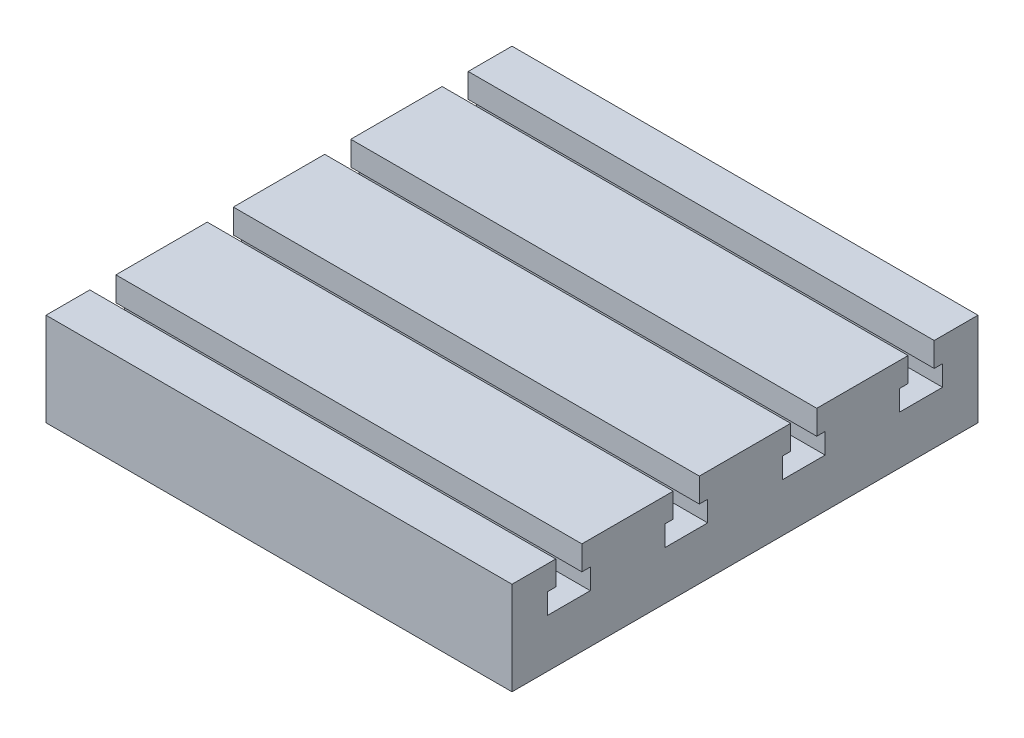
ISO-10303-21;
HEADER;
FILE_DESCRIPTION(('STEP AP214'),'2;1');
FILE_NAME('part.step','',(''),(''),'','','');
FILE_SCHEMA(('AUTOMOTIVE_DESIGN { 1 0 10303 214 1 1 1 1 }'));
ENDSEC;
DATA;
#1=APPLICATION_CONTEXT('core data for automotive mechanical design processes');
#2=APPLICATION_PROTOCOL_DEFINITION('international standard','automotive_design',2000,#1);
#3=PRODUCT_CONTEXT('',#1,'mechanical');
#4=PRODUCT('Part','Part','',(#3));
#5=PRODUCT_RELATED_PRODUCT_CATEGORY('part','',(#4));
#6=PRODUCT_DEFINITION_FORMATION('','',#4);
#7=PRODUCT_DEFINITION_CONTEXT('part definition',#1,'design');
#8=PRODUCT_DEFINITION('design','',#6,#7);
#9=PRODUCT_DEFINITION_SHAPE('','',#8);
#10=(LENGTH_UNIT() NAMED_UNIT(*) SI_UNIT(.MILLI.,.METRE.));
#11=(NAMED_UNIT(*) PLANE_ANGLE_UNIT() SI_UNIT($,.RADIAN.));
#12=(NAMED_UNIT(*) SI_UNIT($,.STERADIAN.) SOLID_ANGLE_UNIT());
#13=UNCERTAINTY_MEASURE_WITH_UNIT(LENGTH_MEASURE(1.E-05),#10,'distance_accuracy_value','');
#14=(GEOMETRIC_REPRESENTATION_CONTEXT(3) GLOBAL_UNCERTAINTY_ASSIGNED_CONTEXT((#13)) GLOBAL_UNIT_ASSIGNED_CONTEXT((#10,
#11,#12)) REPRESENTATION_CONTEXT('',''));
#15=CARTESIAN_POINT('',(0.,0.,0.));
#16=DIRECTION('',(0.,0.,1.));
#17=DIRECTION('',(1.,0.,0.));
#18=AXIS2_PLACEMENT_3D('',#15,#16,#17);
#19=CARTESIAN_POINT('',(-125.,0.,-125.));
#20=DIRECTION('',(0.,1.,0.));
#21=DIRECTION('',(0.,0.,1.));
#22=AXIS2_PLACEMENT_3D('',#19,#20,#21);
#23=PLANE('',#22);
#24=DIRECTION('',(1.,0.,0.));
#25=VECTOR('',#24,1.);
#26=CARTESIAN_POINT('',(-125.,0.,-101.5));
#27=LINE('',#26,#25);
#28=CARTESIAN_POINT('',(-125.,0.,-101.5));
#29=VERTEX_POINT('',#28);
#30=CARTESIAN_POINT('',(125.,0.,-101.5));
#31=VERTEX_POINT('',#30);
#32=EDGE_CURVE('E268',#29,#31,#27,.T.);
#33=ORIENTED_EDGE('',*,*,#32,.T.);
#34=DIRECTION('',(0.,0.,1.));
#35=VECTOR('',#34,1.);
#36=CARTESIAN_POINT('',(125.,0.,-125.));
#37=LINE('',#36,#35);
#38=CARTESIAN_POINT('',(125.,0.,-125.));
#39=VERTEX_POINT('',#38);
#40=EDGE_CURVE('E316',#39,#31,#37,.T.);
#41=ORIENTED_EDGE('',*,*,#40,.F.);
#42=DIRECTION('',(1.,0.,0.));
#43=VECTOR('',#42,1.);
#44=CARTESIAN_POINT('',(-125.,0.,-125.));
#45=LINE('',#44,#43);
#46=CARTESIAN_POINT('',(-125.,0.,-125.));
#47=VERTEX_POINT('',#46);
#48=EDGE_CURVE('E36',#47,#39,#45,.T.);
#49=ORIENTED_EDGE('',*,*,#48,.F.);
#50=DIRECTION('',(0.,0.,1.));
#51=VECTOR('',#50,1.);
#52=CARTESIAN_POINT('',(-125.,0.,-125.));
#53=LINE('',#52,#51);
#54=EDGE_CURVE('E285',#47,#29,#53,.T.);
#55=ORIENTED_EDGE('',*,*,#54,.T.);
#56=EDGE_LOOP('',(#33,#41,#49,#55));
#57=FACE_BOUND('',#56,.T.);
#58=ADVANCED_FACE('F32',(#57),#23,.T.);
#59=DIRECTION('',(1.,0.,0.));
#60=VECTOR('',#59,1.);
#61=CARTESIAN_POINT('',(-125.,0.,-87.5));
#62=LINE('',#61,#60);
#63=CARTESIAN_POINT('',(-125.,0.,-87.5));
#64=VERTEX_POINT('',#63);
#65=CARTESIAN_POINT('',(125.,0.,-87.5));
#66=VERTEX_POINT('',#65);
#67=EDGE_CURVE('E49',#64,#66,#62,.T.);
#68=ORIENTED_EDGE('',*,*,#67,.F.);
#69=CARTESIAN_POINT('',(-125.,0.,-38.5));
#70=VERTEX_POINT('',#69);
#71=EDGE_CURVE('E293',#64,#70,#53,.T.);
#72=ORIENTED_EDGE('',*,*,#71,.T.);
#73=DIRECTION('',(1.,0.,0.));
#74=VECTOR('',#73,1.);
#75=CARTESIAN_POINT('',(-125.,0.,-38.5));
#76=LINE('',#75,#74);
#77=CARTESIAN_POINT('',(125.,0.,-38.5));
#78=VERTEX_POINT('',#77);
#79=EDGE_CURVE('E442',#70,#78,#76,.T.);
#80=ORIENTED_EDGE('',*,*,#79,.T.);
#81=EDGE_CURVE('E318',#66,#78,#37,.T.);
#82=ORIENTED_EDGE('',*,*,#81,.F.);
#83=EDGE_LOOP('',(#68,#72,#80,#82));
#84=FACE_BOUND('',#83,.T.);
#85=ADVANCED_FACE('F546',(#84),#23,.T.);
#86=DIRECTION('',(1.,0.,0.));
#87=VECTOR('',#86,1.);
#88=CARTESIAN_POINT('',(-125.,0.,-24.5));
#89=LINE('',#88,#87);
#90=CARTESIAN_POINT('',(-125.,0.,-24.5));
#91=VERTEX_POINT('',#90);
#92=CARTESIAN_POINT('',(125.,0.,-24.5));
#93=VERTEX_POINT('',#92);
#94=EDGE_CURVE('E57',#91,#93,#89,.T.);
#95=ORIENTED_EDGE('',*,*,#94,.F.);
#96=CARTESIAN_POINT('',(-125.,0.,24.5));
#97=VERTEX_POINT('',#96);
#98=EDGE_CURVE('E299',#91,#97,#53,.T.);
#99=ORIENTED_EDGE('',*,*,#98,.T.);
#100=DIRECTION('',(1.,0.,0.));
#101=VECTOR('',#100,1.);
#102=CARTESIAN_POINT('',(-125.,0.,24.5));
#103=LINE('',#102,#101);
#104=CARTESIAN_POINT('',(125.,0.,24.5));
#105=VERTEX_POINT('',#104);
#106=EDGE_CURVE('E383',#97,#105,#103,.T.);
#107=ORIENTED_EDGE('',*,*,#106,.T.);
#108=EDGE_CURVE('E550',#93,#105,#37,.T.);
#109=ORIENTED_EDGE('',*,*,#108,.F.);
#110=EDGE_LOOP('',(#95,#99,#107,#109));
#111=FACE_BOUND('',#110,.T.);
#112=ADVANCED_FACE('F632',(#111),#23,.T.);
#113=DIRECTION('',(1.,0.,0.));
#114=VECTOR('',#113,1.);
#115=CARTESIAN_POINT('',(-125.,0.,38.5));
#116=LINE('',#115,#114);
#117=CARTESIAN_POINT('',(-125.,0.,38.5));
#118=VERTEX_POINT('',#117);
#119=CARTESIAN_POINT('',(125.,0.,38.5));
#120=VERTEX_POINT('',#119);
#121=EDGE_CURVE('E386',#118,#120,#116,.T.);
#122=ORIENTED_EDGE('',*,*,#121,.F.);
#123=CARTESIAN_POINT('',(-125.,0.,87.5));
#124=VERTEX_POINT('',#123);
#125=EDGE_CURVE('E301',#118,#124,#53,.T.);
#126=ORIENTED_EDGE('',*,*,#125,.T.);
#127=DIRECTION('',(1.,0.,0.));
#128=VECTOR('',#127,1.);
#129=CARTESIAN_POINT('',(-125.,0.,87.5));
#130=LINE('',#129,#128);
#131=CARTESIAN_POINT('',(125.,0.,87.5));
#132=VERTEX_POINT('',#131);
#133=EDGE_CURVE('E323',#124,#132,#130,.T.);
#134=ORIENTED_EDGE('',*,*,#133,.T.);
#135=EDGE_CURVE('E551',#120,#132,#37,.T.);
#136=ORIENTED_EDGE('',*,*,#135,.F.);
#137=EDGE_LOOP('',(#122,#126,#134,#136));
#138=FACE_BOUND('',#137,.T.);
#139=ADVANCED_FACE('F603',(#138),#23,.T.);
#140=CARTESIAN_POINT('',(-125.,0.,-125.));
#141=DIRECTION('',(0.,0.,-1.));
#142=DIRECTION('',(-1.,0.,0.));
#143=AXIS2_PLACEMENT_3D('',#140,#141,#142);
#144=PLANE('',#143);
#145=ORIENTED_EDGE('',*,*,#48,.T.);
#146=DIRECTION('',(0.,1.,0.));
#147=VECTOR('',#146,1.);
#148=CARTESIAN_POINT('',(125.,0.,-125.));
#149=LINE('',#148,#147);
#150=CARTESIAN_POINT('',(125.,-50.,-125.));
#151=VERTEX_POINT('',#150);
#152=EDGE_CURVE('E320',#151,#39,#149,.T.);
#153=ORIENTED_EDGE('',*,*,#152,.F.);
#154=DIRECTION('',(1.,0.,0.));
#155=VECTOR('',#154,1.);
#156=CARTESIAN_POINT('',(-125.,-50.,-125.));
#157=LINE('',#156,#155);
#158=CARTESIAN_POINT('',(-125.,-50.,-125.));
#159=VERTEX_POINT('',#158);
#160=EDGE_CURVE('E11',#159,#151,#157,.T.);
#161=ORIENTED_EDGE('',*,*,#160,.F.);
#162=DIRECTION('',(0.,1.,0.));
#163=VECTOR('',#162,1.);
#164=CARTESIAN_POINT('',(-125.,0.,-125.));
#165=LINE('',#164,#163);
#166=EDGE_CURVE('E302',#159,#47,#165,.T.);
#167=ORIENTED_EDGE('',*,*,#166,.T.);
#168=EDGE_LOOP('',(#145,#153,#161,#167));
#169=FACE_BOUND('',#168,.T.);
#170=ADVANCED_FACE('F34',(#169),#144,.T.);
#171=CARTESIAN_POINT('',(-125.,-50.,125.));
#172=DIRECTION('',(0.,-1.,0.));
#173=DIRECTION('',(0.,0.,-1.));
#174=AXIS2_PLACEMENT_3D('',#171,#172,#173);
#175=PLANE('',#174);
#176=ORIENTED_EDGE('',*,*,#160,.T.);
#177=DIRECTION('',(0.,0.,-1.));
#178=VECTOR('',#177,1.);
#179=CARTESIAN_POINT('',(125.,-50.,125.));
#180=LINE('',#179,#178);
#181=CARTESIAN_POINT('',(125.,-50.,125.));
#182=VERTEX_POINT('',#181);
#183=EDGE_CURVE('E308',#182,#151,#180,.T.);
#184=ORIENTED_EDGE('',*,*,#183,.F.);
#185=DIRECTION('',(1.,0.,0.));
#186=VECTOR('',#185,1.);
#187=CARTESIAN_POINT('',(-125.,-50.,125.));
#188=LINE('',#187,#186);
#189=CARTESIAN_POINT('',(-125.,-50.,125.));
#190=VERTEX_POINT('',#189);
#191=EDGE_CURVE('E41',#190,#182,#188,.T.);
#192=ORIENTED_EDGE('',*,*,#191,.F.);
#193=DIRECTION('',(0.,0.,-1.));
#194=VECTOR('',#193,1.);
#195=CARTESIAN_POINT('',(-125.,-50.,125.));
#196=LINE('',#195,#194);
#197=EDGE_CURVE('E297',#190,#159,#196,.T.);
#198=ORIENTED_EDGE('',*,*,#197,.T.);
#199=EDGE_LOOP('',(#176,#184,#192,#198));
#200=FACE_BOUND('',#199,.T.);
#201=ADVANCED_FACE('F574',(#200),#175,.T.);
#202=CARTESIAN_POINT('',(-125.,0.,125.));
#203=DIRECTION('',(0.,0.,1.));
#204=DIRECTION('',(1.,0.,0.));
#205=AXIS2_PLACEMENT_3D('',#202,#203,#204);
#206=PLANE('',#205);
#207=ORIENTED_EDGE('',*,*,#191,.T.);
#208=DIRECTION('',(0.,-1.,0.));
#209=VECTOR('',#208,1.);
#210=CARTESIAN_POINT('',(125.,0.,125.));
#211=LINE('',#210,#209);
#212=CARTESIAN_POINT('',(125.,0.,125.));
#213=VERTEX_POINT('',#212);
#214=EDGE_CURVE('E311',#213,#182,#211,.T.);
#215=ORIENTED_EDGE('',*,*,#214,.F.);
#216=DIRECTION('',(1.,0.,0.));
#217=VECTOR('',#216,1.);
#218=CARTESIAN_POINT('',(-125.,0.,125.));
#219=LINE('',#218,#217);
#220=CARTESIAN_POINT('',(-125.,0.,125.));
#221=VERTEX_POINT('',#220);
#222=EDGE_CURVE('E563',#221,#213,#219,.T.);
#223=ORIENTED_EDGE('',*,*,#222,.F.);
#224=DIRECTION('',(0.,-1.,0.));
#225=VECTOR('',#224,1.);
#226=CARTESIAN_POINT('',(-125.,0.,125.));
#227=LINE('',#226,#225);
#228=EDGE_CURVE('E292',#221,#190,#227,.T.);
#229=ORIENTED_EDGE('',*,*,#228,.T.);
#230=EDGE_LOOP('',(#207,#215,#223,#229));
#231=FACE_BOUND('',#230,.T.);
#232=ADVANCED_FACE('F567',(#231),#206,.T.);
#233=DIRECTION('',(1.,0.,0.));
#234=VECTOR('',#233,1.);
#235=CARTESIAN_POINT('',(-125.,0.,101.5));
#236=LINE('',#235,#234);
#237=CARTESIAN_POINT('',(-125.,0.,101.5));
#238=VERTEX_POINT('',#237);
#239=CARTESIAN_POINT('',(125.,0.,101.5));
#240=VERTEX_POINT('',#239);
#241=EDGE_CURVE('E324',#238,#240,#236,.T.);
#242=ORIENTED_EDGE('',*,*,#241,.F.);
#243=EDGE_CURVE('E295',#238,#221,#53,.T.);
#244=ORIENTED_EDGE('',*,*,#243,.T.);
#245=ORIENTED_EDGE('',*,*,#222,.T.);
#246=EDGE_CURVE('E319',#240,#213,#37,.T.);
#247=ORIENTED_EDGE('',*,*,#246,.F.);
#248=EDGE_LOOP('',(#242,#244,#245,#247));
#249=FACE_BOUND('',#248,.T.);
#250=ADVANCED_FACE('F564',(#249),#23,.T.);
#251=CARTESIAN_POINT('',(-125.,0.,0.));
#252=DIRECTION('',(1.,0.,0.));
#253=DIRECTION('',(0.,0.,-1.));
#254=AXIS2_PLACEMENT_3D('',#251,#252,#253);
#255=PLANE('',#254);
#256=DIRECTION('',(0.,0.,1.));
#257=VECTOR('',#256,1.);
#258=CARTESIAN_POINT('',(-125.,-12.9999999999999,-106.));
#259=LINE('',#258,#257);
#260=CARTESIAN_POINT('',(-125.,-12.9999999999999,-106.));
#261=VERTEX_POINT('',#260);
#262=CARTESIAN_POINT('',(-125.,-12.9999999999999,-101.5));
#263=VERTEX_POINT('',#262);
#264=EDGE_CURVE('E279',#261,#263,#259,.T.);
#265=ORIENTED_EDGE('',*,*,#264,.T.);
#266=DIRECTION('',(0.,1.,0.));
#267=VECTOR('',#266,1.);
#268=CARTESIAN_POINT('',(-125.,-12.9999999999999,-101.5));
#269=LINE('',#268,#267);
#270=EDGE_CURVE('E271',#263,#29,#269,.T.);
#271=ORIENTED_EDGE('',*,*,#270,.T.);
#272=ORIENTED_EDGE('',*,*,#54,.F.);
#273=ORIENTED_EDGE('',*,*,#166,.F.);
#274=ORIENTED_EDGE('',*,*,#197,.F.);
#275=ORIENTED_EDGE('',*,*,#228,.F.);
#276=ORIENTED_EDGE('',*,*,#243,.F.);
#277=DIRECTION('',(0.,-1.,0.));
#278=VECTOR('',#277,1.);
#279=CARTESIAN_POINT('',(-125.,0.,101.5));
#280=LINE('',#279,#278);
#281=CARTESIAN_POINT('',(-125.,-13.,101.5));
#282=VERTEX_POINT('',#281);
#283=EDGE_CURVE('E344',#238,#282,#280,.T.);
#284=ORIENTED_EDGE('',*,*,#283,.T.);
#285=DIRECTION('',(0.,0.,1.));
#286=VECTOR('',#285,1.);
#287=CARTESIAN_POINT('',(-125.,-13.,101.5));
#288=LINE('',#287,#286);
#289=CARTESIAN_POINT('',(-125.,-13.,106.));
#290=VERTEX_POINT('',#289);
#291=EDGE_CURVE('E378',#282,#290,#288,.T.);
#292=ORIENTED_EDGE('',*,*,#291,.T.);
#293=DIRECTION('',(0.,-1.,0.));
#294=VECTOR('',#293,1.);
#295=CARTESIAN_POINT('',(-125.,-13.,106.));
#296=LINE('',#295,#294);
#297=CARTESIAN_POINT('',(-125.,-24.,106.));
#298=VERTEX_POINT('',#297);
#299=EDGE_CURVE('E375',#290,#298,#296,.T.);
#300=ORIENTED_EDGE('',*,*,#299,.T.);
#301=DIRECTION('',(0.,0.,-1.));
#302=VECTOR('',#301,1.);
#303=CARTESIAN_POINT('',(-125.,-24.,106.));
#304=LINE('',#303,#302);
#305=CARTESIAN_POINT('',(-125.,-24.,83.));
#306=VERTEX_POINT('',#305);
#307=EDGE_CURVE('E372',#298,#306,#304,.T.);
#308=ORIENTED_EDGE('',*,*,#307,.T.);
#309=DIRECTION('',(0.,1.,0.));
#310=VECTOR('',#309,1.);
#311=CARTESIAN_POINT('',(-125.,-24.,83.));
#312=LINE('',#311,#310);
#313=CARTESIAN_POINT('',(-125.,-13.,83.));
#314=VERTEX_POINT('',#313);
#315=EDGE_CURVE('E369',#306,#314,#312,.T.);
#316=ORIENTED_EDGE('',*,*,#315,.T.);
#317=DIRECTION('',(0.,0.,1.));
#318=VECTOR('',#317,1.);
#319=CARTESIAN_POINT('',(-125.,-13.,83.));
#320=LINE('',#319,#318);
#321=CARTESIAN_POINT('',(-125.,-13.,87.5));
#322=VERTEX_POINT('',#321);
#323=EDGE_CURVE('E366',#314,#322,#320,.T.);
#324=ORIENTED_EDGE('',*,*,#323,.T.);
#325=DIRECTION('',(0.,1.,0.));
#326=VECTOR('',#325,1.);
#327=CARTESIAN_POINT('',(-125.,-13.,87.5));
#328=LINE('',#327,#326);
#329=EDGE_CURVE('E327',#322,#124,#328,.T.);
#330=ORIENTED_EDGE('',*,*,#329,.T.);
#331=ORIENTED_EDGE('',*,*,#125,.F.);
#332=DIRECTION('',(0.,-1.,0.));
#333=VECTOR('',#332,1.);
#334=CARTESIAN_POINT('',(-125.,0.,38.5));
#335=LINE('',#334,#333);
#336=CARTESIAN_POINT('',(-125.,-13.,38.5));
#337=VERTEX_POINT('',#336);
#338=EDGE_CURVE('E437',#118,#337,#335,.T.);
#339=ORIENTED_EDGE('',*,*,#338,.T.);
#340=DIRECTION('',(0.,0.,1.));
#341=VECTOR('',#340,1.);
#342=CARTESIAN_POINT('',(-125.,-13.,38.5));
#343=LINE('',#342,#341);
#344=CARTESIAN_POINT('',(-125.,-13.,43.));
#345=VERTEX_POINT('',#344);
#346=EDGE_CURVE('E434',#337,#345,#343,.T.);
#347=ORIENTED_EDGE('',*,*,#346,.T.);
#348=DIRECTION('',(0.,-1.,0.));
#349=VECTOR('',#348,1.);
#350=CARTESIAN_POINT('',(-125.,-13.,43.));
#351=LINE('',#350,#349);
#352=CARTESIAN_POINT('',(-125.,-24.,43.));
#353=VERTEX_POINT('',#352);
#354=EDGE_CURVE('E431',#345,#353,#351,.T.);
#355=ORIENTED_EDGE('',*,*,#354,.T.);
#356=DIRECTION('',(0.,0.,-1.));
#357=VECTOR('',#356,1.);
#358=CARTESIAN_POINT('',(-125.,-24.,43.));
#359=LINE('',#358,#357);
#360=CARTESIAN_POINT('',(-125.,-24.,20.));
#361=VERTEX_POINT('',#360);
#362=EDGE_CURVE('E428',#353,#361,#359,.T.);
#363=ORIENTED_EDGE('',*,*,#362,.T.);
#364=DIRECTION('',(0.,1.,0.));
#365=VECTOR('',#364,1.);
#366=CARTESIAN_POINT('',(-125.,-24.,20.));
#367=LINE('',#366,#365);
#368=CARTESIAN_POINT('',(-125.,-13.,20.));
#369=VERTEX_POINT('',#368);
#370=EDGE_CURVE('E425',#361,#369,#367,.T.);
#371=ORIENTED_EDGE('',*,*,#370,.T.);
#372=DIRECTION('',(0.,0.,1.));
#373=VECTOR('',#372,1.);
#374=CARTESIAN_POINT('',(-125.,-13.,20.));
#375=LINE('',#374,#373);
#376=CARTESIAN_POINT('',(-125.,-13.,24.5));
#377=VERTEX_POINT('',#376);
#378=EDGE_CURVE('E387',#369,#377,#375,.T.);
#379=ORIENTED_EDGE('',*,*,#378,.T.);
#380=DIRECTION('',(0.,1.,0.));
#381=VECTOR('',#380,1.);
#382=CARTESIAN_POINT('',(-125.,-13.,24.5));
#383=LINE('',#382,#381);
#384=EDGE_CURVE('E403',#377,#97,#383,.T.);
#385=ORIENTED_EDGE('',*,*,#384,.T.);
#386=ORIENTED_EDGE('',*,*,#98,.F.);
#387=DIRECTION('',(0.,-1.,0.));
#388=VECTOR('',#387,1.);
#389=CARTESIAN_POINT('',(-125.,0.,-24.5));
#390=LINE('',#389,#388);
#391=CARTESIAN_POINT('',(-125.,-13.,-24.5));
#392=VERTEX_POINT('',#391);
#393=EDGE_CURVE('E494',#91,#392,#390,.T.);
#394=ORIENTED_EDGE('',*,*,#393,.T.);
#395=DIRECTION('',(0.,0.,1.));
#396=VECTOR('',#395,1.);
#397=CARTESIAN_POINT('',(-125.,-13.,-24.5));
#398=LINE('',#397,#396);
#399=CARTESIAN_POINT('',(-125.,-13.,-20.));
#400=VERTEX_POINT('',#399);
#401=EDGE_CURVE('E491',#392,#400,#398,.T.);
#402=ORIENTED_EDGE('',*,*,#401,.T.);
#403=DIRECTION('',(0.,-1.,0.));
#404=VECTOR('',#403,1.);
#405=CARTESIAN_POINT('',(-125.,-13.,-20.));
#406=LINE('',#405,#404);
#407=CARTESIAN_POINT('',(-125.,-24.,-20.));
#408=VERTEX_POINT('',#407);
#409=EDGE_CURVE('E488',#400,#408,#406,.T.);
#410=ORIENTED_EDGE('',*,*,#409,.T.);
#411=DIRECTION('',(0.,0.,-1.));
#412=VECTOR('',#411,1.);
#413=CARTESIAN_POINT('',(-125.,-24.,-20.));
#414=LINE('',#413,#412);
#415=CARTESIAN_POINT('',(-125.,-24.,-43.));
#416=VERTEX_POINT('',#415);
#417=EDGE_CURVE('E485',#408,#416,#414,.T.);
#418=ORIENTED_EDGE('',*,*,#417,.T.);
#419=DIRECTION('',(0.,1.,0.));
#420=VECTOR('',#419,1.);
#421=CARTESIAN_POINT('',(-125.,-24.,-43.));
#422=LINE('',#421,#420);
#423=CARTESIAN_POINT('',(-125.,-13.,-43.));
#424=VERTEX_POINT('',#423);
#425=EDGE_CURVE('E482',#416,#424,#422,.T.);
#426=ORIENTED_EDGE('',*,*,#425,.T.);
#427=DIRECTION('',(0.,0.,1.));
#428=VECTOR('',#427,1.);
#429=CARTESIAN_POINT('',(-125.,-13.,-43.));
#430=LINE('',#429,#428);
#431=CARTESIAN_POINT('',(-125.,-13.,-38.5));
#432=VERTEX_POINT('',#431);
#433=EDGE_CURVE('E445',#424,#432,#430,.T.);
#434=ORIENTED_EDGE('',*,*,#433,.T.);
#435=DIRECTION('',(0.,1.,0.));
#436=VECTOR('',#435,1.);
#437=CARTESIAN_POINT('',(-125.,-13.,-38.5));
#438=LINE('',#437,#436);
#439=EDGE_CURVE('E461',#432,#70,#438,.T.);
#440=ORIENTED_EDGE('',*,*,#439,.T.);
#441=ORIENTED_EDGE('',*,*,#71,.F.);
#442=DIRECTION('',(0.,-1.,0.));
#443=VECTOR('',#442,1.);
#444=CARTESIAN_POINT('',(-125.,0.,-87.5));
#445=LINE('',#444,#443);
#446=CARTESIAN_POINT('',(-125.,-12.9999999999999,-87.5));
#447=VERTEX_POINT('',#446);
#448=EDGE_CURVE('E289',#64,#447,#445,.T.);
#449=ORIENTED_EDGE('',*,*,#448,.T.);
#450=DIRECTION('',(0.,0.,1.));
#451=VECTOR('',#450,1.);
#452=CARTESIAN_POINT('',(-125.,-12.9999999999999,-87.5));
#453=LINE('',#452,#451);
#454=CARTESIAN_POINT('',(-125.,-13.,-83.));
#455=VERTEX_POINT('',#454);
#456=EDGE_CURVE('E537',#447,#455,#453,.T.);
#457=ORIENTED_EDGE('',*,*,#456,.T.);
#458=DIRECTION('',(0.,-1.,0.));
#459=VECTOR('',#458,1.);
#460=CARTESIAN_POINT('',(-125.,-13.,-83.));
#461=LINE('',#460,#459);
#462=CARTESIAN_POINT('',(-125.,-24.,-83.));
#463=VERTEX_POINT('',#462);
#464=EDGE_CURVE('E534',#455,#463,#461,.T.);
#465=ORIENTED_EDGE('',*,*,#464,.T.);
#466=DIRECTION('',(0.,0.,-1.));
#467=VECTOR('',#466,1.);
#468=CARTESIAN_POINT('',(-125.,-24.,-83.));
#469=LINE('',#468,#467);
#470=CARTESIAN_POINT('',(-125.,-24.,-106.));
#471=VERTEX_POINT('',#470);
#472=EDGE_CURVE('E531',#463,#471,#469,.T.);
#473=ORIENTED_EDGE('',*,*,#472,.T.);
#474=DIRECTION('',(0.,1.,0.));
#475=VECTOR('',#474,1.);
#476=CARTESIAN_POINT('',(-125.,-24.,-106.));
#477=LINE('',#476,#475);
#478=EDGE_CURVE('E529',#471,#261,#477,.T.);
#479=ORIENTED_EDGE('',*,*,#478,.T.);
#480=EDGE_LOOP('',(#265,#271,#272,#273,#274,#275,#276,#284,#292,#300,#308,#316,#324,#330,#331,
#339,#347,#355,#363,#371,#379,#385,#386,#394,#402,#410,#418,#426,#434,#440,#441,#449,#457,#465,
#473,#479));
#481=FACE_BOUND('',#480,.T.);
#482=ADVANCED_FACE('F283',(#481),#255,.F.);
#483=CARTESIAN_POINT('',(125.,0.,0.));
#484=DIRECTION('',(1.,0.,0.));
#485=DIRECTION('',(0.,0.,-1.));
#486=AXIS2_PLACEMENT_3D('',#483,#484,#485);
#487=PLANE('',#486);
#488=DIRECTION('',(0.,1.,0.));
#489=VECTOR('',#488,1.);
#490=CARTESIAN_POINT('',(125.,-12.9999999999999,-101.5));
#491=LINE('',#490,#489);
#492=CARTESIAN_POINT('',(125.,-12.9999999999999,-101.5));
#493=VERTEX_POINT('',#492);
#494=EDGE_CURVE('E274',#493,#31,#491,.T.);
#495=ORIENTED_EDGE('',*,*,#494,.F.);
#496=DIRECTION('',(0.,0.,1.));
#497=VECTOR('',#496,1.);
#498=CARTESIAN_POINT('',(125.,-12.9999999999999,-106.));
#499=LINE('',#498,#497);
#500=CARTESIAN_POINT('',(125.,-12.9999999999999,-106.));
#501=VERTEX_POINT('',#500);
#502=EDGE_CURVE('E290',#501,#493,#499,.T.);
#503=ORIENTED_EDGE('',*,*,#502,.F.);
#504=DIRECTION('',(0.,1.,0.));
#505=VECTOR('',#504,1.);
#506=CARTESIAN_POINT('',(125.,-24.,-106.));
#507=LINE('',#506,#505);
#508=CARTESIAN_POINT('',(125.,-24.,-106.));
#509=VERTEX_POINT('',#508);
#510=EDGE_CURVE('E513',#509,#501,#507,.T.);
#511=ORIENTED_EDGE('',*,*,#510,.F.);
#512=DIRECTION('',(0.,0.,-1.));
#513=VECTOR('',#512,1.);
#514=CARTESIAN_POINT('',(125.,-24.,-83.));
#515=LINE('',#514,#513);
#516=CARTESIAN_POINT('',(125.,-24.,-83.));
#517=VERTEX_POINT('',#516);
#518=EDGE_CURVE('E516',#517,#509,#515,.T.);
#519=ORIENTED_EDGE('',*,*,#518,.F.);
#520=DIRECTION('',(0.,-1.,0.));
#521=VECTOR('',#520,1.);
#522=CARTESIAN_POINT('',(125.,-13.,-83.));
#523=LINE('',#522,#521);
#524=CARTESIAN_POINT('',(125.,-13.,-83.));
#525=VERTEX_POINT('',#524);
#526=EDGE_CURVE('E519',#525,#517,#523,.T.);
#527=ORIENTED_EDGE('',*,*,#526,.F.);
#528=DIRECTION('',(0.,0.,1.));
#529=VECTOR('',#528,1.);
#530=CARTESIAN_POINT('',(125.,-12.9999999999999,-87.5));
#531=LINE('',#530,#529);
#532=CARTESIAN_POINT('',(125.,-12.9999999999999,-87.5));
#533=VERTEX_POINT('',#532);
#534=EDGE_CURVE('E522',#533,#525,#531,.T.);
#535=ORIENTED_EDGE('',*,*,#534,.F.);
#536=DIRECTION('',(0.,-1.,0.));
#537=VECTOR('',#536,1.);
#538=CARTESIAN_POINT('',(125.,0.,-87.5));
#539=LINE('',#538,#537);
#540=EDGE_CURVE('E525',#66,#533,#539,.T.);
#541=ORIENTED_EDGE('',*,*,#540,.F.);
#542=ORIENTED_EDGE('',*,*,#81,.T.);
#543=DIRECTION('',(0.,1.,0.));
#544=VECTOR('',#543,1.);
#545=CARTESIAN_POINT('',(125.,-13.,-38.5));
#546=LINE('',#545,#544);
#547=CARTESIAN_POINT('',(125.,-13.,-38.5));
#548=VERTEX_POINT('',#547);
#549=EDGE_CURVE('E476',#548,#78,#546,.T.);
#550=ORIENTED_EDGE('',*,*,#549,.F.);
#551=DIRECTION('',(0.,0.,1.));
#552=VECTOR('',#551,1.);
#553=CARTESIAN_POINT('',(125.,-13.,-43.));
#554=LINE('',#553,#552);
#555=CARTESIAN_POINT('',(125.,-13.,-43.));
#556=VERTEX_POINT('',#555);
#557=EDGE_CURVE('E458',#556,#548,#554,.T.);
#558=ORIENTED_EDGE('',*,*,#557,.F.);
#559=DIRECTION('',(0.,1.,0.));
#560=VECTOR('',#559,1.);
#561=CARTESIAN_POINT('',(125.,-24.,-43.));
#562=LINE('',#561,#560);
#563=CARTESIAN_POINT('',(125.,-24.,-43.));
#564=VERTEX_POINT('',#563);
#565=EDGE_CURVE('E462',#564,#556,#562,.T.);
#566=ORIENTED_EDGE('',*,*,#565,.F.);
#567=DIRECTION('',(0.,0.,-1.));
#568=VECTOR('',#567,1.);
#569=CARTESIAN_POINT('',(125.,-24.,-20.));
#570=LINE('',#569,#568);
#571=CARTESIAN_POINT('',(125.,-24.,-20.));
#572=VERTEX_POINT('',#571);
#573=EDGE_CURVE('E465',#572,#564,#570,.T.);
#574=ORIENTED_EDGE('',*,*,#573,.F.);
#575=DIRECTION('',(0.,-1.,0.));
#576=VECTOR('',#575,1.);
#577=CARTESIAN_POINT('',(125.,-13.,-20.));
#578=LINE('',#577,#576);
#579=CARTESIAN_POINT('',(125.,-13.,-20.));
#580=VERTEX_POINT('',#579);
#581=EDGE_CURVE('E468',#580,#572,#578,.T.);
#582=ORIENTED_EDGE('',*,*,#581,.F.);
#583=DIRECTION('',(0.,0.,1.));
#584=VECTOR('',#583,1.);
#585=CARTESIAN_POINT('',(125.,-13.,-24.5));
#586=LINE('',#585,#584);
#587=CARTESIAN_POINT('',(125.,-13.,-24.5));
#588=VERTEX_POINT('',#587);
#589=EDGE_CURVE('E471',#588,#580,#586,.T.);
#590=ORIENTED_EDGE('',*,*,#589,.F.);
#591=DIRECTION('',(0.,-1.,0.));
#592=VECTOR('',#591,1.);
#593=CARTESIAN_POINT('',(125.,0.,-24.5));
#594=LINE('',#593,#592);
#595=EDGE_CURVE('E474',#93,#588,#594,.T.);
#596=ORIENTED_EDGE('',*,*,#595,.F.);
#597=ORIENTED_EDGE('',*,*,#108,.T.);
#598=DIRECTION('',(0.,1.,0.));
#599=VECTOR('',#598,1.);
#600=CARTESIAN_POINT('',(125.,-13.,24.5));
#601=LINE('',#600,#599);
#602=CARTESIAN_POINT('',(125.,-13.,24.5));
#603=VERTEX_POINT('',#602);
#604=EDGE_CURVE('E419',#603,#105,#601,.T.);
#605=ORIENTED_EDGE('',*,*,#604,.F.);
#606=DIRECTION('',(0.,0.,1.));
#607=VECTOR('',#606,1.);
#608=CARTESIAN_POINT('',(125.,-13.,20.));
#609=LINE('',#608,#607);
#610=CARTESIAN_POINT('',(125.,-13.,20.));
#611=VERTEX_POINT('',#610);
#612=EDGE_CURVE('E400',#611,#603,#609,.T.);
#613=ORIENTED_EDGE('',*,*,#612,.F.);
#614=DIRECTION('',(0.,1.,0.));
#615=VECTOR('',#614,1.);
#616=CARTESIAN_POINT('',(125.,-24.,20.));
#617=LINE('',#616,#615);
#618=CARTESIAN_POINT('',(125.,-24.,20.));
#619=VERTEX_POINT('',#618);
#620=EDGE_CURVE('E404',#619,#611,#617,.T.);
#621=ORIENTED_EDGE('',*,*,#620,.F.);
#622=DIRECTION('',(0.,0.,-1.));
#623=VECTOR('',#622,1.);
#624=CARTESIAN_POINT('',(125.,-24.,43.));
#625=LINE('',#624,#623);
#626=CARTESIAN_POINT('',(125.,-24.,43.));
#627=VERTEX_POINT('',#626);
#628=EDGE_CURVE('E407',#627,#619,#625,.T.);
#629=ORIENTED_EDGE('',*,*,#628,.F.);
#630=DIRECTION('',(0.,-1.,0.));
#631=VECTOR('',#630,1.);
#632=CARTESIAN_POINT('',(125.,-13.,43.));
#633=LINE('',#632,#631);
#634=CARTESIAN_POINT('',(125.,-13.,43.));
#635=VERTEX_POINT('',#634);
#636=EDGE_CURVE('E410',#635,#627,#633,.T.);
#637=ORIENTED_EDGE('',*,*,#636,.F.);
#638=DIRECTION('',(0.,0.,1.));
#639=VECTOR('',#638,1.);
#640=CARTESIAN_POINT('',(125.,-13.,38.5));
#641=LINE('',#640,#639);
#642=CARTESIAN_POINT('',(125.,-13.,38.5));
#643=VERTEX_POINT('',#642);
#644=EDGE_CURVE('E413',#643,#635,#641,.T.);
#645=ORIENTED_EDGE('',*,*,#644,.F.);
#646=DIRECTION('',(0.,-1.,0.));
#647=VECTOR('',#646,1.);
#648=CARTESIAN_POINT('',(125.,0.,38.5));
#649=LINE('',#648,#647);
#650=EDGE_CURVE('E416',#120,#643,#649,.T.);
#651=ORIENTED_EDGE('',*,*,#650,.F.);
#652=ORIENTED_EDGE('',*,*,#135,.T.);
#653=DIRECTION('',(0.,1.,0.));
#654=VECTOR('',#653,1.);
#655=CARTESIAN_POINT('',(125.,-13.,87.5));
#656=LINE('',#655,#654);
#657=CARTESIAN_POINT('',(125.,-13.,87.5));
#658=VERTEX_POINT('',#657);
#659=EDGE_CURVE('E341',#658,#132,#656,.T.);
#660=ORIENTED_EDGE('',*,*,#659,.F.);
#661=DIRECTION('',(0.,0.,1.));
#662=VECTOR('',#661,1.);
#663=CARTESIAN_POINT('',(125.,-13.,83.));
#664=LINE('',#663,#662);
#665=CARTESIAN_POINT('',(125.,-13.,83.));
#666=VERTEX_POINT('',#665);
#667=EDGE_CURVE('E345',#666,#658,#664,.T.);
#668=ORIENTED_EDGE('',*,*,#667,.F.);
#669=DIRECTION('',(0.,1.,0.));
#670=VECTOR('',#669,1.);
#671=CARTESIAN_POINT('',(125.,-24.,83.));
#672=LINE('',#671,#670);
#673=CARTESIAN_POINT('',(125.,-24.,83.));
#674=VERTEX_POINT('',#673);
#675=EDGE_CURVE('E348',#674,#666,#672,.T.);
#676=ORIENTED_EDGE('',*,*,#675,.F.);
#677=DIRECTION('',(0.,0.,-1.));
#678=VECTOR('',#677,1.);
#679=CARTESIAN_POINT('',(125.,-24.,106.));
#680=LINE('',#679,#678);
#681=CARTESIAN_POINT('',(125.,-24.,106.));
#682=VERTEX_POINT('',#681);
#683=EDGE_CURVE('E351',#682,#674,#680,.T.);
#684=ORIENTED_EDGE('',*,*,#683,.F.);
#685=DIRECTION('',(0.,-1.,0.));
#686=VECTOR('',#685,1.);
#687=CARTESIAN_POINT('',(125.,-13.,106.));
#688=LINE('',#687,#686);
#689=CARTESIAN_POINT('',(125.,-13.,106.));
#690=VERTEX_POINT('',#689);
#691=EDGE_CURVE('E354',#690,#682,#688,.T.);
#692=ORIENTED_EDGE('',*,*,#691,.F.);
#693=DIRECTION('',(0.,0.,1.));
#694=VECTOR('',#693,1.);
#695=CARTESIAN_POINT('',(125.,-13.,101.5));
#696=LINE('',#695,#694);
#697=CARTESIAN_POINT('',(125.,-13.,101.5));
#698=VERTEX_POINT('',#697);
#699=EDGE_CURVE('E357',#698,#690,#696,.T.);
#700=ORIENTED_EDGE('',*,*,#699,.F.);
#701=DIRECTION('',(0.,-1.,0.));
#702=VECTOR('',#701,1.);
#703=CARTESIAN_POINT('',(125.,0.,101.5));
#704=LINE('',#703,#702);
#705=EDGE_CURVE('E360',#240,#698,#704,.T.);
#706=ORIENTED_EDGE('',*,*,#705,.F.);
#707=ORIENTED_EDGE('',*,*,#246,.T.);
#708=ORIENTED_EDGE('',*,*,#214,.T.);
#709=ORIENTED_EDGE('',*,*,#183,.T.);
#710=ORIENTED_EDGE('',*,*,#152,.T.);
#711=ORIENTED_EDGE('',*,*,#40,.T.);
#712=EDGE_LOOP('',(#495,#503,#511,#519,#527,#535,#541,#542,#550,#558,#566,#574,#582,#590,#596,
#597,#605,#613,#621,#629,#637,#645,#651,#652,#660,#668,#676,#684,#692,#700,#706,#707,#708,#709,
#710,#711));
#713=FACE_BOUND('',#712,.T.);
#714=ADVANCED_FACE('F559',(#713),#487,.T.);
#715=CARTESIAN_POINT('',(-125.,-13.,87.5));
#716=DIRECTION('',(0.,0.,-1.));
#717=DIRECTION('',(-1.,0.,0.));
#718=AXIS2_PLACEMENT_3D('',#715,#716,#717);
#719=PLANE('',#718);
#720=ORIENTED_EDGE('',*,*,#659,.T.);
#721=ORIENTED_EDGE('',*,*,#133,.F.);
#722=ORIENTED_EDGE('',*,*,#329,.F.);
#723=DIRECTION('',(1.,0.,0.));
#724=VECTOR('',#723,1.);
#725=CARTESIAN_POINT('',(-125.,-13.,87.5));
#726=LINE('',#725,#724);
#727=EDGE_CURVE('E337',#322,#658,#726,.T.);
#728=ORIENTED_EDGE('',*,*,#727,.T.);
#729=EDGE_LOOP('',(#720,#721,#722,#728));
#730=FACE_BOUND('',#729,.T.);
#731=ADVANCED_FACE('F600',(#730),#719,.F.);
#732=CARTESIAN_POINT('',(-125.,-13.,83.));
#733=DIRECTION('',(0.,1.,0.));
#734=DIRECTION('',(0.,0.,1.));
#735=AXIS2_PLACEMENT_3D('',#732,#733,#734);
#736=PLANE('',#735);
#737=ORIENTED_EDGE('',*,*,#667,.T.);
#738=ORIENTED_EDGE('',*,*,#727,.F.);
#739=ORIENTED_EDGE('',*,*,#323,.F.);
#740=DIRECTION('',(1.,0.,0.));
#741=VECTOR('',#740,1.);
#742=CARTESIAN_POINT('',(-125.,-13.,83.));
#743=LINE('',#742,#741);
#744=EDGE_CURVE('E335',#314,#666,#743,.T.);
#745=ORIENTED_EDGE('',*,*,#744,.T.);
#746=EDGE_LOOP('',(#737,#738,#739,#745));
#747=FACE_BOUND('',#746,.T.);
#748=ADVANCED_FACE('F595',(#747),#736,.F.);
#749=CARTESIAN_POINT('',(-125.,-24.,83.));
#750=DIRECTION('',(0.,0.,-1.));
#751=DIRECTION('',(0.,1.,0.));
#752=AXIS2_PLACEMENT_3D('',#749,#750,#751);
#753=PLANE('',#752);
#754=ORIENTED_EDGE('',*,*,#675,.T.);
#755=ORIENTED_EDGE('',*,*,#744,.F.);
#756=ORIENTED_EDGE('',*,*,#315,.F.);
#757=DIRECTION('',(1.,0.,0.));
#758=VECTOR('',#757,1.);
#759=CARTESIAN_POINT('',(-125.,-24.,83.));
#760=LINE('',#759,#758);
#761=EDGE_CURVE('E333',#306,#674,#760,.T.);
#762=ORIENTED_EDGE('',*,*,#761,.T.);
#763=EDGE_LOOP('',(#754,#755,#756,#762));
#764=FACE_BOUND('',#763,.T.);
#765=ADVANCED_FACE('F591',(#764),#753,.F.);
#766=CARTESIAN_POINT('',(-125.,-24.,106.));
#767=DIRECTION('',(0.,-1.,0.));
#768=DIRECTION('',(0.,0.,-1.));
#769=AXIS2_PLACEMENT_3D('',#766,#767,#768);
#770=PLANE('',#769);
#771=ORIENTED_EDGE('',*,*,#683,.T.);
#772=ORIENTED_EDGE('',*,*,#761,.F.);
#773=ORIENTED_EDGE('',*,*,#307,.F.);
#774=DIRECTION('',(1.,0.,0.));
#775=VECTOR('',#774,1.);
#776=CARTESIAN_POINT('',(-125.,-24.,106.));
#777=LINE('',#776,#775);
#778=EDGE_CURVE('E331',#298,#682,#777,.T.);
#779=ORIENTED_EDGE('',*,*,#778,.T.);
#780=EDGE_LOOP('',(#771,#772,#773,#779));
#781=FACE_BOUND('',#780,.T.);
#782=ADVANCED_FACE('F587',(#781),#770,.F.);
#783=CARTESIAN_POINT('',(-125.,-13.,106.));
#784=DIRECTION('',(0.,0.,1.));
#785=DIRECTION('',(1.,0.,0.));
#786=AXIS2_PLACEMENT_3D('',#783,#784,#785);
#787=PLANE('',#786);
#788=ORIENTED_EDGE('',*,*,#691,.T.);
#789=ORIENTED_EDGE('',*,*,#778,.F.);
#790=ORIENTED_EDGE('',*,*,#299,.F.);
#791=DIRECTION('',(1.,0.,0.));
#792=VECTOR('',#791,1.);
#793=CARTESIAN_POINT('',(-125.,-13.,106.));
#794=LINE('',#793,#792);
#795=EDGE_CURVE('E329',#290,#690,#794,.T.);
#796=ORIENTED_EDGE('',*,*,#795,.T.);
#797=EDGE_LOOP('',(#788,#789,#790,#796));
#798=FACE_BOUND('',#797,.T.);
#799=ADVANCED_FACE('F583',(#798),#787,.F.);
#800=CARTESIAN_POINT('',(-125.,-13.,101.5));
#801=DIRECTION('',(0.,1.,0.));
#802=DIRECTION('',(0.,0.,1.));
#803=AXIS2_PLACEMENT_3D('',#800,#801,#802);
#804=PLANE('',#803);
#805=ORIENTED_EDGE('',*,*,#699,.T.);
#806=ORIENTED_EDGE('',*,*,#795,.F.);
#807=ORIENTED_EDGE('',*,*,#291,.F.);
#808=DIRECTION('',(1.,0.,0.));
#809=VECTOR('',#808,1.);
#810=CARTESIAN_POINT('',(-125.,-13.,101.5));
#811=LINE('',#810,#809);
#812=EDGE_CURVE('E326',#282,#698,#811,.T.);
#813=ORIENTED_EDGE('',*,*,#812,.T.);
#814=EDGE_LOOP('',(#805,#806,#807,#813));
#815=FACE_BOUND('',#814,.T.);
#816=ADVANCED_FACE('F579',(#815),#804,.F.);
#817=CARTESIAN_POINT('',(-125.,0.,101.5));
#818=DIRECTION('',(0.,0.,1.));
#819=DIRECTION('',(1.,0.,0.));
#820=AXIS2_PLACEMENT_3D('',#817,#818,#819);
#821=PLANE('',#820);
#822=ORIENTED_EDGE('',*,*,#705,.T.);
#823=ORIENTED_EDGE('',*,*,#812,.F.);
#824=ORIENTED_EDGE('',*,*,#283,.F.);
#825=ORIENTED_EDGE('',*,*,#241,.T.);
#826=EDGE_LOOP('',(#822,#823,#824,#825));
#827=FACE_BOUND('',#826,.T.);
#828=ADVANCED_FACE('F577',(#827),#821,.F.);
#829=CARTESIAN_POINT('',(-125.,-13.,24.5));
#830=DIRECTION('',(0.,0.,-1.));
#831=DIRECTION('',(-1.,0.,0.));
#832=AXIS2_PLACEMENT_3D('',#829,#830,#831);
#833=PLANE('',#832);
#834=ORIENTED_EDGE('',*,*,#604,.T.);
#835=ORIENTED_EDGE('',*,*,#106,.F.);
#836=ORIENTED_EDGE('',*,*,#384,.F.);
#837=DIRECTION('',(1.,0.,0.));
#838=VECTOR('',#837,1.);
#839=CARTESIAN_POINT('',(-125.,-13.,24.5));
#840=LINE('',#839,#838);
#841=EDGE_CURVE('E363',#377,#603,#840,.T.);
#842=ORIENTED_EDGE('',*,*,#841,.T.);
#843=EDGE_LOOP('',(#834,#835,#836,#842));
#844=FACE_BOUND('',#843,.T.);
#845=ADVANCED_FACE('F630',(#844),#833,.F.);
#846=CARTESIAN_POINT('',(-125.,-13.,20.));
#847=DIRECTION('',(0.,1.,0.));
#848=DIRECTION('',(0.,0.,1.));
#849=AXIS2_PLACEMENT_3D('',#846,#847,#848);
#850=PLANE('',#849);
#851=ORIENTED_EDGE('',*,*,#612,.T.);
#852=ORIENTED_EDGE('',*,*,#841,.F.);
#853=ORIENTED_EDGE('',*,*,#378,.F.);
#854=DIRECTION('',(1.,0.,0.));
#855=VECTOR('',#854,1.);
#856=CARTESIAN_POINT('',(-125.,-13.,20.));
#857=LINE('',#856,#855);
#858=EDGE_CURVE('E397',#369,#611,#857,.T.);
#859=ORIENTED_EDGE('',*,*,#858,.T.);
#860=EDGE_LOOP('',(#851,#852,#853,#859));
#861=FACE_BOUND('',#860,.T.);
#862=ADVANCED_FACE('F626',(#861),#850,.F.);
#863=CARTESIAN_POINT('',(-125.,-24.,20.));
#864=DIRECTION('',(0.,0.,-1.));
#865=DIRECTION('',(-1.,0.,0.));
#866=AXIS2_PLACEMENT_3D('',#863,#864,#865);
#867=PLANE('',#866);
#868=ORIENTED_EDGE('',*,*,#620,.T.);
#869=ORIENTED_EDGE('',*,*,#858,.F.);
#870=ORIENTED_EDGE('',*,*,#370,.F.);
#871=DIRECTION('',(1.,0.,0.));
#872=VECTOR('',#871,1.);
#873=CARTESIAN_POINT('',(-125.,-24.,20.));
#874=LINE('',#873,#872);
#875=EDGE_CURVE('E395',#361,#619,#874,.T.);
#876=ORIENTED_EDGE('',*,*,#875,.T.);
#877=EDGE_LOOP('',(#868,#869,#870,#876));
#878=FACE_BOUND('',#877,.T.);
#879=ADVANCED_FACE('F621',(#878),#867,.F.);
#880=CARTESIAN_POINT('',(-125.,-24.,43.));
#881=DIRECTION('',(0.,-1.,0.));
#882=DIRECTION('',(0.,0.,-1.));
#883=AXIS2_PLACEMENT_3D('',#880,#881,#882);
#884=PLANE('',#883);
#885=ORIENTED_EDGE('',*,*,#628,.T.);
#886=ORIENTED_EDGE('',*,*,#875,.F.);
#887=ORIENTED_EDGE('',*,*,#362,.F.);
#888=DIRECTION('',(1.,0.,0.));
#889=VECTOR('',#888,1.);
#890=CARTESIAN_POINT('',(-125.,-24.,43.));
#891=LINE('',#890,#889);
#892=EDGE_CURVE('E393',#353,#627,#891,.T.);
#893=ORIENTED_EDGE('',*,*,#892,.T.);
#894=EDGE_LOOP('',(#885,#886,#887,#893));
#895=FACE_BOUND('',#894,.T.);
#896=ADVANCED_FACE('F617',(#895),#884,.F.);
#897=CARTESIAN_POINT('',(-125.,-13.,43.));
#898=DIRECTION('',(0.,0.,1.));
#899=DIRECTION('',(1.,0.,0.));
#900=AXIS2_PLACEMENT_3D('',#897,#898,#899);
#901=PLANE('',#900);
#902=ORIENTED_EDGE('',*,*,#636,.T.);
#903=ORIENTED_EDGE('',*,*,#892,.F.);
#904=ORIENTED_EDGE('',*,*,#354,.F.);
#905=DIRECTION('',(1.,0.,0.));
#906=VECTOR('',#905,1.);
#907=CARTESIAN_POINT('',(-125.,-13.,43.));
#908=LINE('',#907,#906);
#909=EDGE_CURVE('E391',#345,#635,#908,.T.);
#910=ORIENTED_EDGE('',*,*,#909,.T.);
#911=EDGE_LOOP('',(#902,#903,#904,#910));
#912=FACE_BOUND('',#911,.T.);
#913=ADVANCED_FACE('F615',(#912),#901,.F.);
#914=CARTESIAN_POINT('',(-125.,-13.,38.5));
#915=DIRECTION('',(0.,1.,0.));
#916=DIRECTION('',(0.,0.,1.));
#917=AXIS2_PLACEMENT_3D('',#914,#915,#916);
#918=PLANE('',#917);
#919=ORIENTED_EDGE('',*,*,#644,.T.);
#920=ORIENTED_EDGE('',*,*,#909,.F.);
#921=ORIENTED_EDGE('',*,*,#346,.F.);
#922=DIRECTION('',(1.,0.,0.));
#923=VECTOR('',#922,1.);
#924=CARTESIAN_POINT('',(-125.,-13.,38.5));
#925=LINE('',#924,#923);
#926=EDGE_CURVE('E389',#337,#643,#925,.T.);
#927=ORIENTED_EDGE('',*,*,#926,.T.);
#928=EDGE_LOOP('',(#919,#920,#921,#927));
#929=FACE_BOUND('',#928,.T.);
#930=ADVANCED_FACE('F610',(#929),#918,.F.);
#931=CARTESIAN_POINT('',(-125.,0.,38.5));
#932=DIRECTION('',(0.,0.,1.));
#933=DIRECTION('',(1.,0.,0.));
#934=AXIS2_PLACEMENT_3D('',#931,#932,#933);
#935=PLANE('',#934);
#936=ORIENTED_EDGE('',*,*,#650,.T.);
#937=ORIENTED_EDGE('',*,*,#926,.F.);
#938=ORIENTED_EDGE('',*,*,#338,.F.);
#939=ORIENTED_EDGE('',*,*,#121,.T.);
#940=EDGE_LOOP('',(#936,#937,#938,#939));
#941=FACE_BOUND('',#940,.T.);
#942=ADVANCED_FACE('F605',(#941),#935,.F.);
#943=CARTESIAN_POINT('',(-125.,-13.,-38.5));
#944=DIRECTION('',(0.,0.,-1.));
#945=DIRECTION('',(-1.,0.,0.));
#946=AXIS2_PLACEMENT_3D('',#943,#944,#945);
#947=PLANE('',#946);
#948=ORIENTED_EDGE('',*,*,#549,.T.);
#949=ORIENTED_EDGE('',*,*,#79,.F.);
#950=ORIENTED_EDGE('',*,*,#439,.F.);
#951=DIRECTION('',(1.,0.,0.));
#952=VECTOR('',#951,1.);
#953=CARTESIAN_POINT('',(-125.,-13.,-38.5));
#954=LINE('',#953,#952);
#955=EDGE_CURVE('E422',#432,#548,#954,.T.);
#956=ORIENTED_EDGE('',*,*,#955,.T.);
#957=EDGE_LOOP('',(#948,#949,#950,#956));
#958=FACE_BOUND('',#957,.T.);
#959=ADVANCED_FACE('F656',(#958),#947,.F.);
#960=CARTESIAN_POINT('',(-125.,-13.,-43.));
#961=DIRECTION('',(0.,1.,0.));
#962=DIRECTION('',(0.,0.,1.));
#963=AXIS2_PLACEMENT_3D('',#960,#961,#962);
#964=PLANE('',#963);
#965=ORIENTED_EDGE('',*,*,#557,.T.);
#966=ORIENTED_EDGE('',*,*,#955,.F.);
#967=ORIENTED_EDGE('',*,*,#433,.F.);
#968=DIRECTION('',(1.,0.,0.));
#969=VECTOR('',#968,1.);
#970=CARTESIAN_POINT('',(-125.,-13.,-43.));
#971=LINE('',#970,#969);
#972=EDGE_CURVE('E455',#424,#556,#971,.T.);
#973=ORIENTED_EDGE('',*,*,#972,.T.);
#974=EDGE_LOOP('',(#965,#966,#967,#973));
#975=FACE_BOUND('',#974,.T.);
#976=ADVANCED_FACE('F653',(#975),#964,.F.);
#977=CARTESIAN_POINT('',(-125.,-24.,-43.));
#978=DIRECTION('',(0.,0.,-1.));
#979=DIRECTION('',(-1.,0.,0.));
#980=AXIS2_PLACEMENT_3D('',#977,#978,#979);
#981=PLANE('',#980);
#982=ORIENTED_EDGE('',*,*,#565,.T.);
#983=ORIENTED_EDGE('',*,*,#972,.F.);
#984=ORIENTED_EDGE('',*,*,#425,.F.);
#985=DIRECTION('',(1.,0.,0.));
#986=VECTOR('',#985,1.);
#987=CARTESIAN_POINT('',(-125.,-24.,-43.));
#988=LINE('',#987,#986);
#989=EDGE_CURVE('E453',#416,#564,#988,.T.);
#990=ORIENTED_EDGE('',*,*,#989,.T.);
#991=EDGE_LOOP('',(#982,#983,#984,#990));
#992=FACE_BOUND('',#991,.T.);
#993=ADVANCED_FACE('F649',(#992),#981,.F.);
#994=CARTESIAN_POINT('',(-125.,-24.,-20.));
#995=DIRECTION('',(0.,-1.,0.));
#996=DIRECTION('',(0.,0.,-1.));
#997=AXIS2_PLACEMENT_3D('',#994,#995,#996);
#998=PLANE('',#997);
#999=ORIENTED_EDGE('',*,*,#573,.T.);
#1000=ORIENTED_EDGE('',*,*,#989,.F.);
#1001=ORIENTED_EDGE('',*,*,#417,.F.);
#1002=DIRECTION('',(1.,0.,0.));
#1003=VECTOR('',#1002,1.);
#1004=CARTESIAN_POINT('',(-125.,-24.,-20.));
#1005=LINE('',#1004,#1003);
#1006=EDGE_CURVE('E451',#408,#572,#1005,.T.);
#1007=ORIENTED_EDGE('',*,*,#1006,.T.);
#1008=EDGE_LOOP('',(#999,#1000,#1001,#1007));
#1009=FACE_BOUND('',#1008,.T.);
#1010=ADVANCED_FACE('F645',(#1009),#998,.F.);
#1011=CARTESIAN_POINT('',(-125.,-13.,-20.));
#1012=DIRECTION('',(0.,0.,1.));
#1013=DIRECTION('',(1.,0.,0.));
#1014=AXIS2_PLACEMENT_3D('',#1011,#1012,#1013);
#1015=PLANE('',#1014);
#1016=ORIENTED_EDGE('',*,*,#581,.T.);
#1017=ORIENTED_EDGE('',*,*,#1006,.F.);
#1018=ORIENTED_EDGE('',*,*,#409,.F.);
#1019=DIRECTION('',(1.,0.,0.));
#1020=VECTOR('',#1019,1.);
#1021=CARTESIAN_POINT('',(-125.,-13.,-20.));
#1022=LINE('',#1021,#1020);
#1023=EDGE_CURVE('E449',#400,#580,#1022,.T.);
#1024=ORIENTED_EDGE('',*,*,#1023,.T.);
#1025=EDGE_LOOP('',(#1016,#1017,#1018,#1024));
#1026=FACE_BOUND('',#1025,.T.);
#1027=ADVANCED_FACE('F641',(#1026),#1015,.F.);
#1028=CARTESIAN_POINT('',(-125.,-13.,-24.5));
#1029=DIRECTION('',(0.,1.,0.));
#1030=DIRECTION('',(0.,0.,1.));
#1031=AXIS2_PLACEMENT_3D('',#1028,#1029,#1030);
#1032=PLANE('',#1031);
#1033=ORIENTED_EDGE('',*,*,#589,.T.);
#1034=ORIENTED_EDGE('',*,*,#1023,.F.);
#1035=ORIENTED_EDGE('',*,*,#401,.F.);
#1036=DIRECTION('',(1.,0.,0.));
#1037=VECTOR('',#1036,1.);
#1038=CARTESIAN_POINT('',(-125.,-13.,-24.5));
#1039=LINE('',#1038,#1037);
#1040=EDGE_CURVE('E447',#392,#588,#1039,.T.);
#1041=ORIENTED_EDGE('',*,*,#1040,.T.);
#1042=EDGE_LOOP('',(#1033,#1034,#1035,#1041));
#1043=FACE_BOUND('',#1042,.T.);
#1044=ADVANCED_FACE('F637',(#1043),#1032,.F.);
#1045=CARTESIAN_POINT('',(-125.,0.,-24.5));
#1046=DIRECTION('',(0.,0.,1.));
#1047=DIRECTION('',(0.,-1.,0.));
#1048=AXIS2_PLACEMENT_3D('',#1045,#1046,#1047);
#1049=PLANE('',#1048);
#1050=ORIENTED_EDGE('',*,*,#595,.T.);
#1051=ORIENTED_EDGE('',*,*,#1040,.F.);
#1052=ORIENTED_EDGE('',*,*,#393,.F.);
#1053=ORIENTED_EDGE('',*,*,#94,.T.);
#1054=EDGE_LOOP('',(#1050,#1051,#1052,#1053));
#1055=FACE_BOUND('',#1054,.T.);
#1056=ADVANCED_FACE('F634',(#1055),#1049,.F.);
#1057=CARTESIAN_POINT('',(-125.,-12.9999999999999,-101.5));
#1058=DIRECTION('',(0.,0.,-1.));
#1059=DIRECTION('',(-1.,0.,0.));
#1060=AXIS2_PLACEMENT_3D('',#1057,#1058,#1059);
#1061=PLANE('',#1060);
#1062=ORIENTED_EDGE('',*,*,#494,.T.);
#1063=ORIENTED_EDGE('',*,*,#32,.F.);
#1064=ORIENTED_EDGE('',*,*,#270,.F.);
#1065=DIRECTION('',(1.,0.,0.));
#1066=VECTOR('',#1065,1.);
#1067=CARTESIAN_POINT('',(-125.,-12.9999999999999,-101.5));
#1068=LINE('',#1067,#1066);
#1069=EDGE_CURVE('E479',#263,#493,#1068,.T.);
#1070=ORIENTED_EDGE('',*,*,#1069,.T.);
#1071=EDGE_LOOP('',(#1062,#1063,#1064,#1070));
#1072=FACE_BOUND('',#1071,.T.);
#1073=ADVANCED_FACE('F270',(#1072),#1061,.F.);
#1074=CARTESIAN_POINT('',(-125.,-12.9999999999999,-106.));
#1075=DIRECTION('',(0.,1.,0.));
#1076=DIRECTION('',(0.,0.,1.));
#1077=AXIS2_PLACEMENT_3D('',#1074,#1075,#1076);
#1078=PLANE('',#1077);
#1079=ORIENTED_EDGE('',*,*,#502,.T.);
#1080=ORIENTED_EDGE('',*,*,#1069,.F.);
#1081=ORIENTED_EDGE('',*,*,#264,.F.);
#1082=DIRECTION('',(1.,0.,0.));
#1083=VECTOR('',#1082,1.);
#1084=CARTESIAN_POINT('',(-125.,-12.9999999999999,-106.));
#1085=LINE('',#1084,#1083);
#1086=EDGE_CURVE('E508',#261,#501,#1085,.T.);
#1087=ORIENTED_EDGE('',*,*,#1086,.T.);
#1088=EDGE_LOOP('',(#1079,#1080,#1081,#1087));
#1089=FACE_BOUND('',#1088,.T.);
#1090=ADVANCED_FACE('F828',(#1089),#1078,.F.);
#1091=CARTESIAN_POINT('',(-125.,-24.,-106.));
#1092=DIRECTION('',(0.,0.,-1.));
#1093=DIRECTION('',(-1.,0.,0.));
#1094=AXIS2_PLACEMENT_3D('',#1091,#1092,#1093);
#1095=PLANE('',#1094);
#1096=ORIENTED_EDGE('',*,*,#510,.T.);
#1097=ORIENTED_EDGE('',*,*,#1086,.F.);
#1098=ORIENTED_EDGE('',*,*,#478,.F.);
#1099=DIRECTION('',(1.,0.,0.));
#1100=VECTOR('',#1099,1.);
#1101=CARTESIAN_POINT('',(-125.,-24.,-106.));
#1102=LINE('',#1101,#1100);
#1103=EDGE_CURVE('E506',#471,#509,#1102,.T.);
#1104=ORIENTED_EDGE('',*,*,#1103,.T.);
#1105=EDGE_LOOP('',(#1096,#1097,#1098,#1104));
#1106=FACE_BOUND('',#1105,.T.);
#1107=ADVANCED_FACE('F837',(#1106),#1095,.F.);
#1108=CARTESIAN_POINT('',(-125.,-24.,-83.));
#1109=DIRECTION('',(0.,-1.,0.));
#1110=DIRECTION('',(0.,0.,-1.));
#1111=AXIS2_PLACEMENT_3D('',#1108,#1109,#1110);
#1112=PLANE('',#1111);
#1113=ORIENTED_EDGE('',*,*,#518,.T.);
#1114=ORIENTED_EDGE('',*,*,#1103,.F.);
#1115=ORIENTED_EDGE('',*,*,#472,.F.);
#1116=DIRECTION('',(1.,0.,0.));
#1117=VECTOR('',#1116,1.);
#1118=CARTESIAN_POINT('',(-125.,-24.,-83.));
#1119=LINE('',#1118,#1117);
#1120=EDGE_CURVE('E504',#463,#517,#1119,.T.);
#1121=ORIENTED_EDGE('',*,*,#1120,.T.);
#1122=EDGE_LOOP('',(#1113,#1114,#1115,#1121));
#1123=FACE_BOUND('',#1122,.T.);
#1124=ADVANCED_FACE('F847',(#1123),#1112,.F.);
#1125=CARTESIAN_POINT('',(-125.,-13.,-83.));
#1126=DIRECTION('',(0.,0.,1.));
#1127=DIRECTION('',(1.,0.,0.));
#1128=AXIS2_PLACEMENT_3D('',#1125,#1126,#1127);
#1129=PLANE('',#1128);
#1130=ORIENTED_EDGE('',*,*,#526,.T.);
#1131=ORIENTED_EDGE('',*,*,#1120,.F.);
#1132=ORIENTED_EDGE('',*,*,#464,.F.);
#1133=DIRECTION('',(1.,0.,0.));
#1134=VECTOR('',#1133,1.);
#1135=CARTESIAN_POINT('',(-125.,-13.,-83.));
#1136=LINE('',#1135,#1134);
#1137=EDGE_CURVE('E502',#455,#525,#1136,.T.);
#1138=ORIENTED_EDGE('',*,*,#1137,.T.);
#1139=EDGE_LOOP('',(#1130,#1131,#1132,#1138));
#1140=FACE_BOUND('',#1139,.T.);
#1141=ADVANCED_FACE('F857',(#1140),#1129,.F.);
#1142=CARTESIAN_POINT('',(-125.,-12.9999999999999,-87.5));
#1143=DIRECTION('',(0.,1.,0.));
#1144=DIRECTION('',(0.,0.,1.));
#1145=AXIS2_PLACEMENT_3D('',#1142,#1143,#1144);
#1146=PLANE('',#1145);
#1147=ORIENTED_EDGE('',*,*,#534,.T.);
#1148=ORIENTED_EDGE('',*,*,#1137,.F.);
#1149=ORIENTED_EDGE('',*,*,#456,.F.);
#1150=DIRECTION('',(1.,0.,0.));
#1151=VECTOR('',#1150,1.);
#1152=CARTESIAN_POINT('',(-125.,-12.9999999999999,-87.5));
#1153=LINE('',#1152,#1151);
#1154=EDGE_CURVE('E500',#447,#533,#1153,.T.);
#1155=ORIENTED_EDGE('',*,*,#1154,.T.);
#1156=EDGE_LOOP('',(#1147,#1148,#1149,#1155));
#1157=FACE_BOUND('',#1156,.T.);
#1158=ADVANCED_FACE('F867',(#1157),#1146,.F.);
#1159=CARTESIAN_POINT('',(-125.,0.,-87.5));
#1160=DIRECTION('',(0.,0.,1.));
#1161=DIRECTION('',(1.,0.,0.));
#1162=AXIS2_PLACEMENT_3D('',#1159,#1160,#1161);
#1163=PLANE('',#1162);
#1164=ORIENTED_EDGE('',*,*,#540,.T.);
#1165=ORIENTED_EDGE('',*,*,#1154,.F.);
#1166=ORIENTED_EDGE('',*,*,#448,.F.);
#1167=ORIENTED_EDGE('',*,*,#67,.T.);
#1168=EDGE_LOOP('',(#1164,#1165,#1166,#1167));
#1169=FACE_BOUND('',#1168,.T.);
#1170=ADVANCED_FACE('F543',(#1169),#1163,.F.);
#1171=CLOSED_SHELL('',(#58,#85,#112,#139,#170,#201,#232,#250,#482,#714,#731,#748,#765,#782,#799,
#816,#828,#845,#862,#879,#896,#913,#930,#942,#959,#976,#993,#1010,#1027,#1044,#1056,#1073,#1090,
#1107,#1124,#1141,#1158,#1170));
#1172=MANIFOLD_SOLID_BREP('B2',#1171);
#1173=ADVANCED_BREP_SHAPE_REPRESENTATION('',(#18,#1172),#14);
#1174=SHAPE_DEFINITION_REPRESENTATION(#9,#1173);
ENDSEC;
END-ISO-10303-21;
